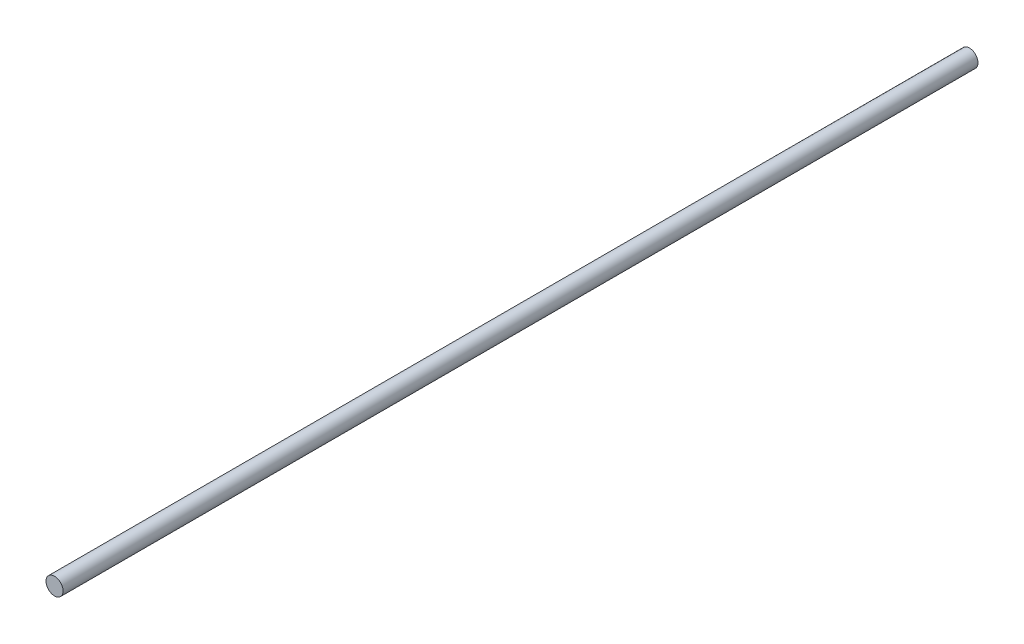
ISO-10303-21;
HEADER;
FILE_DESCRIPTION(('STEP AP214'),'2;1');
FILE_NAME('part.step','',(''),(''),'','','');
FILE_SCHEMA(('AUTOMOTIVE_DESIGN { 1 0 10303 214 1 1 1 1 }'));
ENDSEC;
DATA;
#1=APPLICATION_CONTEXT('core data for automotive mechanical design processes');
#2=APPLICATION_PROTOCOL_DEFINITION('international standard','automotive_design',2000,#1);
#3=PRODUCT_CONTEXT('',#1,'mechanical');
#4=PRODUCT('Part','Part','',(#3));
#5=PRODUCT_RELATED_PRODUCT_CATEGORY('part','',(#4));
#6=PRODUCT_DEFINITION_FORMATION('','',#4);
#7=PRODUCT_DEFINITION_CONTEXT('part definition',#1,'design');
#8=PRODUCT_DEFINITION('design','',#6,#7);
#9=PRODUCT_DEFINITION_SHAPE('','',#8);
#10=(LENGTH_UNIT() NAMED_UNIT(*) SI_UNIT(.MILLI.,.METRE.));
#11=(NAMED_UNIT(*) PLANE_ANGLE_UNIT() SI_UNIT($,.RADIAN.));
#12=(NAMED_UNIT(*) SI_UNIT($,.STERADIAN.) SOLID_ANGLE_UNIT());
#13=UNCERTAINTY_MEASURE_WITH_UNIT(LENGTH_MEASURE(1.E-05),#10,'distance_accuracy_value','');
#14=(GEOMETRIC_REPRESENTATION_CONTEXT(3) GLOBAL_UNCERTAINTY_ASSIGNED_CONTEXT((#13)) GLOBAL_UNIT_ASSIGNED_CONTEXT((#10,
#11,#12)) REPRESENTATION_CONTEXT('',''));
#15=CARTESIAN_POINT('',(0.,0.,0.));
#16=DIRECTION('',(0.,0.,1.));
#17=DIRECTION('',(1.,0.,0.));
#18=AXIS2_PLACEMENT_3D('',#15,#16,#17);
#19=CARTESIAN_POINT('',(0.,0.,171.));
#20=DIRECTION('',(0.,0.,-1.));
#21=DIRECTION('',(-1.,0.,0.));
#22=AXIS2_PLACEMENT_3D('',#19,#20,#21);
#23=CYLINDRICAL_SURFACE('',#22,1.6);
#24=CARTESIAN_POINT('',(0.,0.,171.));
#25=DIRECTION('',(0.,0.,1.));
#26=DIRECTION('',(1.,0.,0.));
#27=AXIS2_PLACEMENT_3D('',#24,#25,#26);
#28=CIRCLE('',#27,1.6);
#29=CARTESIAN_POINT('',(1.6,0.,171.));
#30=VERTEX_POINT('',#29);
#31=EDGE_CURVE('E10',#30,#30,#28,.T.);
#32=ORIENTED_EDGE('',*,*,#31,.F.);
#33=EDGE_LOOP('',(#32));
#34=FACE_BOUND('',#33,.T.);
#35=CARTESIAN_POINT('',(0.,0.,0.));
#36=DIRECTION('',(0.,0.,1.));
#37=DIRECTION('',(1.,0.,0.));
#38=AXIS2_PLACEMENT_3D('',#35,#36,#37);
#39=CIRCLE('',#38,1.6);
#40=CARTESIAN_POINT('',(1.6,0.,0.));
#41=VERTEX_POINT('',#40);
#42=EDGE_CURVE('E46',#41,#41,#39,.T.);
#43=ORIENTED_EDGE('',*,*,#42,.T.);
#44=EDGE_LOOP('',(#43));
#45=FACE_BOUND('',#44,.T.);
#46=ADVANCED_FACE('F43',(#34,#45),#23,.T.);
#47=CARTESIAN_POINT('',(0.,0.,171.));
#48=DIRECTION('',(0.,0.,1.));
#49=DIRECTION('',(1.,0.,0.));
#50=AXIS2_PLACEMENT_3D('',#47,#48,#49);
#51=PLANE('',#50);
#52=ORIENTED_EDGE('',*,*,#31,.T.);
#53=EDGE_LOOP('',(#52));
#54=FACE_BOUND('',#53,.T.);
#55=ADVANCED_FACE('F60',(#54),#51,.T.);
#56=CARTESIAN_POINT('',(0.,0.,0.));
#57=DIRECTION('',(0.,0.,1.));
#58=DIRECTION('',(1.,0.,0.));
#59=AXIS2_PLACEMENT_3D('',#56,#57,#58);
#60=PLANE('',#59);
#61=ORIENTED_EDGE('',*,*,#42,.F.);
#62=EDGE_LOOP('',(#61));
#63=FACE_BOUND('',#62,.T.);
#64=ADVANCED_FACE('F58',(#63),#60,.F.);
#65=CLOSED_SHELL('',(#46,#55,#64));
#66=MANIFOLD_SOLID_BREP('B2',#65);
#67=ADVANCED_BREP_SHAPE_REPRESENTATION('',(#18,#66),#14);
#68=SHAPE_DEFINITION_REPRESENTATION(#9,#67);
ENDSEC;
END-ISO-10303-21;
